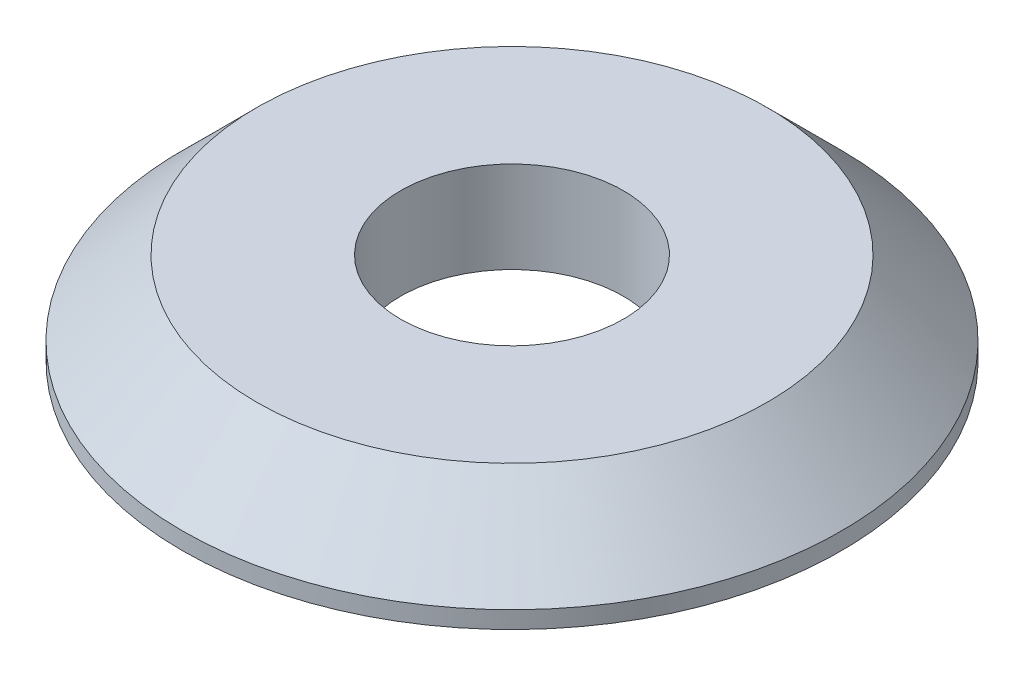
ISO-10303-21;
HEADER;
FILE_DESCRIPTION(('STEP AP214'),'2;1');
FILE_NAME('part.step','',(''),(''),'','','');
FILE_SCHEMA(('AUTOMOTIVE_DESIGN { 1 0 10303 214 1 1 1 1 }'));
ENDSEC;
DATA;
#1=APPLICATION_CONTEXT('core data for automotive mechanical design processes');
#2=APPLICATION_PROTOCOL_DEFINITION('international standard','automotive_design',2000,#1);
#3=PRODUCT_CONTEXT('',#1,'mechanical');
#4=PRODUCT('Part','Part','',(#3));
#5=PRODUCT_RELATED_PRODUCT_CATEGORY('part','',(#4));
#6=PRODUCT_DEFINITION_FORMATION('','',#4);
#7=PRODUCT_DEFINITION_CONTEXT('part definition',#1,'design');
#8=PRODUCT_DEFINITION('design','',#6,#7);
#9=PRODUCT_DEFINITION_SHAPE('','',#8);
#10=(LENGTH_UNIT() NAMED_UNIT(*) SI_UNIT(.MILLI.,.METRE.));
#11=(NAMED_UNIT(*) PLANE_ANGLE_UNIT() SI_UNIT($,.RADIAN.));
#12=(NAMED_UNIT(*) SI_UNIT($,.STERADIAN.) SOLID_ANGLE_UNIT());
#13=UNCERTAINTY_MEASURE_WITH_UNIT(LENGTH_MEASURE(1.E-05),#10,'distance_accuracy_value','');
#14=(GEOMETRIC_REPRESENTATION_CONTEXT(3) GLOBAL_UNCERTAINTY_ASSIGNED_CONTEXT((#13)) GLOBAL_UNIT_ASSIGNED_CONTEXT((#10,
#11,#12)) REPRESENTATION_CONTEXT('',''));
#15=CARTESIAN_POINT('',(0.,0.,0.));
#16=DIRECTION('',(0.,0.,1.));
#17=DIRECTION('',(1.,0.,0.));
#18=AXIS2_PLACEMENT_3D('',#15,#16,#17);
#19=CARTESIAN_POINT('',(0.,1.25095,0.));
#20=DIRECTION('',(0.,1.,0.));
#21=DIRECTION('',(0.,0.,1.));
#22=AXIS2_PLACEMENT_3D('',#19,#20,#21);
#23=PLANE('',#22);
#24=CARTESIAN_POINT('',(0.,1.25095,0.));
#25=DIRECTION('',(0.,1.,0.));
#26=DIRECTION('',(0.,0.,1.));
#27=AXIS2_PLACEMENT_3D('',#24,#25,#26);
#28=CIRCLE('',#27,6.98499999999999);
#29=CARTESIAN_POINT('',(0.,1.25095,6.98499999999999));
#30=VERTEX_POINT('',#29);
#31=EDGE_CURVE('E39',#30,#30,#28,.T.);
#32=ORIENTED_EDGE('',*,*,#31,.T.);
#33=EDGE_LOOP('',(#32));
#34=FACE_BOUND('',#33,.T.);
#35=CARTESIAN_POINT('',(0.,1.25095,0.));
#36=DIRECTION('',(0.,1.,0.));
#37=DIRECTION('',(0.,0.,1.));
#38=AXIS2_PLACEMENT_3D('',#35,#36,#37);
#39=CIRCLE('',#38,3.048);
#40=CARTESIAN_POINT('',(0.,1.25095,3.048));
#41=VERTEX_POINT('',#40);
#42=EDGE_CURVE('E47',#41,#41,#39,.T.);
#43=ORIENTED_EDGE('',*,*,#42,.F.);
#44=EDGE_LOOP('',(#43));
#45=FACE_BOUND('',#44,.T.);
#46=ADVANCED_FACE('F32',(#34,#45),#23,.T.);
#47=CARTESIAN_POINT('',(0.,-1.25095,0.));
#48=DIRECTION('',(0.,1.,0.));
#49=DIRECTION('',(0.,0.,1.));
#50=AXIS2_PLACEMENT_3D('',#47,#48,#49);
#51=PLANE('',#50);
#52=CARTESIAN_POINT('',(0.,-1.25095,0.));
#53=DIRECTION('',(0.,1.,0.));
#54=DIRECTION('',(0.,0.,1.));
#55=AXIS2_PLACEMENT_3D('',#52,#53,#54);
#56=CIRCLE('',#55,9.017);
#57=CARTESIAN_POINT('',(0.,-1.25095,9.017));
#58=VERTEX_POINT('',#57);
#59=EDGE_CURVE('E43',#58,#58,#56,.T.);
#60=ORIENTED_EDGE('',*,*,#59,.F.);
#61=EDGE_LOOP('',(#60));
#62=FACE_BOUND('',#61,.T.);
#63=CARTESIAN_POINT('',(0.,-1.25095,0.));
#64=DIRECTION('',(0.,1.,0.));
#65=DIRECTION('',(0.,0.,1.));
#66=AXIS2_PLACEMENT_3D('',#63,#64,#65);
#67=CIRCLE('',#66,3.048);
#68=CARTESIAN_POINT('',(0.,-1.25095,3.048));
#69=VERTEX_POINT('',#68);
#70=EDGE_CURVE('E50',#69,#69,#67,.T.);
#71=ORIENTED_EDGE('',*,*,#70,.T.);
#72=EDGE_LOOP('',(#71));
#73=FACE_BOUND('',#72,.T.);
#74=ADVANCED_FACE('F60',(#62,#73),#51,.F.);
#75=CARTESIAN_POINT('',(0.,1.25095,0.));
#76=DIRECTION('',(0.,-1.,0.));
#77=DIRECTION('',(0.,0.,-1.));
#78=AXIS2_PLACEMENT_3D('',#75,#76,#77);
#79=CYLINDRICAL_SURFACE('',#78,9.017);
#80=CARTESIAN_POINT('',(0.,-0.781050000000011,0.));
#81=DIRECTION('',(0.,1.,0.));
#82=DIRECTION('',(0.,0.,1.));
#83=AXIS2_PLACEMENT_3D('',#80,#81,#82);
#84=CIRCLE('',#83,9.017);
#85=CARTESIAN_POINT('',(0.,-0.781050000000011,9.017));
#86=VERTEX_POINT('',#85);
#87=EDGE_CURVE('E10',#86,#86,#84,.F.);
#88=ORIENTED_EDGE('',*,*,#87,.T.);
#89=EDGE_LOOP('',(#88));
#90=FACE_BOUND('',#89,.T.);
#91=ORIENTED_EDGE('',*,*,#59,.T.);
#92=EDGE_LOOP('',(#91));
#93=FACE_BOUND('',#92,.T.);
#94=ADVANCED_FACE('F65',(#90,#93),#79,.T.);
#95=CARTESIAN_POINT('',(0.,1.25095,0.));
#96=DIRECTION('',(0.,-1.,0.));
#97=DIRECTION('',(0.,0.,-1.));
#98=AXIS2_PLACEMENT_3D('',#95,#96,#97);
#99=CYLINDRICAL_SURFACE('',#98,3.048);
#100=ORIENTED_EDGE('',*,*,#42,.T.);
#101=EDGE_LOOP('',(#100));
#102=FACE_BOUND('',#101,.T.);
#103=ORIENTED_EDGE('',*,*,#70,.F.);
#104=EDGE_LOOP('',(#103));
#105=FACE_BOUND('',#104,.T.);
#106=ADVANCED_FACE('F56',(#102,#105),#99,.F.);
#107=CARTESIAN_POINT('',(0.,1.25095,0.));
#108=DIRECTION('',(0.,-1.,0.));
#109=DIRECTION('',(0.,0.,-1.));
#110=AXIS2_PLACEMENT_3D('',#107,#108,#109);
#111=CONICAL_SURFACE('',#110,6.98499999999999,0.785398163397447);
#112=ORIENTED_EDGE('',*,*,#87,.F.);
#113=EDGE_LOOP('',(#112));
#114=FACE_BOUND('',#113,.T.);
#115=ORIENTED_EDGE('',*,*,#31,.F.);
#116=EDGE_LOOP('',(#115));
#117=FACE_BOUND('',#116,.T.);
#118=ADVANCED_FACE('F34',(#114,#117),#111,.T.);
#119=CLOSED_SHELL('',(#46,#74,#94,#106,#118));
#120=MANIFOLD_SOLID_BREP('B2',#119);
#121=ADVANCED_BREP_SHAPE_REPRESENTATION('',(#18,#120),#14);
#122=SHAPE_DEFINITION_REPRESENTATION(#9,#121);
ENDSEC;
END-ISO-10303-21;
